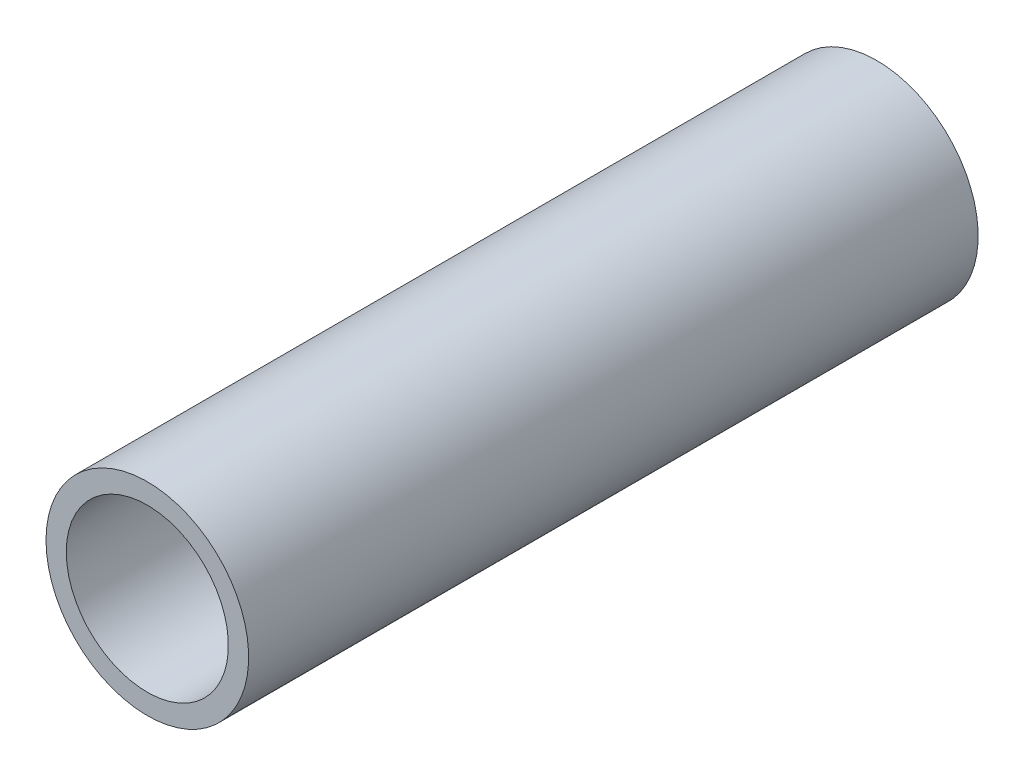
ISO-10303-21;
HEADER;
FILE_DESCRIPTION(('STEP AP214'),'2;1');
FILE_NAME('part.step','',(''),(''),'','','');
FILE_SCHEMA(('AUTOMOTIVE_DESIGN { 1 0 10303 214 1 1 1 1 }'));
ENDSEC;
DATA;
#1=APPLICATION_CONTEXT('core data for automotive mechanical design processes');
#2=APPLICATION_PROTOCOL_DEFINITION('international standard','automotive_design',2000,#1);
#3=PRODUCT_CONTEXT('',#1,'mechanical');
#4=PRODUCT('Part','Part','',(#3));
#5=PRODUCT_RELATED_PRODUCT_CATEGORY('part','',(#4));
#6=PRODUCT_DEFINITION_FORMATION('','',#4);
#7=PRODUCT_DEFINITION_CONTEXT('part definition',#1,'design');
#8=PRODUCT_DEFINITION('design','',#6,#7);
#9=PRODUCT_DEFINITION_SHAPE('','',#8);
#10=(LENGTH_UNIT() NAMED_UNIT(*) SI_UNIT(.MILLI.,.METRE.));
#11=(NAMED_UNIT(*) PLANE_ANGLE_UNIT() SI_UNIT($,.RADIAN.));
#12=(NAMED_UNIT(*) SI_UNIT($,.STERADIAN.) SOLID_ANGLE_UNIT());
#13=UNCERTAINTY_MEASURE_WITH_UNIT(LENGTH_MEASURE(1.E-05),#10,'distance_accuracy_value','');
#14=(GEOMETRIC_REPRESENTATION_CONTEXT(3) GLOBAL_UNCERTAINTY_ASSIGNED_CONTEXT((#13)) GLOBAL_UNIT_ASSIGNED_CONTEXT((#10,
#11,#12)) REPRESENTATION_CONTEXT('',''));
#15=CARTESIAN_POINT('',(0.,0.,0.));
#16=DIRECTION('',(0.,0.,1.));
#17=DIRECTION('',(1.,0.,0.));
#18=AXIS2_PLACEMENT_3D('',#15,#16,#17);
#19=CARTESIAN_POINT('',(0.,0.,90.));
#20=DIRECTION('',(0.,0.,1.));
#21=DIRECTION('',(1.,0.,0.));
#22=AXIS2_PLACEMENT_3D('',#19,#20,#21);
#23=PLANE('',#22);
#24=CARTESIAN_POINT('',(0.,0.,90.));
#25=DIRECTION('',(0.,0.,1.));
#26=DIRECTION('',(1.,0.,0.));
#27=AXIS2_PLACEMENT_3D('',#24,#25,#26);
#28=CIRCLE('',#27,12.5);
#29=CARTESIAN_POINT('',(-12.5,0.,90.));
#30=VERTEX_POINT('',#29);
#31=EDGE_CURVE('E10',#30,#30,#28,.T.);
#32=ORIENTED_EDGE('',*,*,#31,.T.);
#33=EDGE_LOOP('',(#32));
#34=FACE_BOUND('',#33,.T.);
#35=CARTESIAN_POINT('',(0.,0.,90.));
#36=DIRECTION('',(0.,0.,1.));
#37=DIRECTION('',(1.,0.,0.));
#38=AXIS2_PLACEMENT_3D('',#35,#36,#37);
#39=CIRCLE('',#38,10.);
#40=CARTESIAN_POINT('',(-10.,0.,90.));
#41=VERTEX_POINT('',#40);
#42=EDGE_CURVE('E52',#41,#41,#39,.T.);
#43=ORIENTED_EDGE('',*,*,#42,.F.);
#44=EDGE_LOOP('',(#43));
#45=FACE_BOUND('',#44,.T.);
#46=ADVANCED_FACE('F39',(#34,#45),#23,.T.);
#47=CARTESIAN_POINT('',(0.,0.,0.));
#48=DIRECTION('',(0.,0.,1.));
#49=DIRECTION('',(1.,0.,0.));
#50=AXIS2_PLACEMENT_3D('',#47,#48,#49);
#51=PLANE('',#50);
#52=CARTESIAN_POINT('',(0.,0.,0.));
#53=DIRECTION('',(0.,0.,1.));
#54=DIRECTION('',(1.,0.,0.));
#55=AXIS2_PLACEMENT_3D('',#52,#53,#54);
#56=CIRCLE('',#55,12.5);
#57=CARTESIAN_POINT('',(-12.5,0.,0.));
#58=VERTEX_POINT('',#57);
#59=EDGE_CURVE('E43',#58,#58,#56,.T.);
#60=ORIENTED_EDGE('',*,*,#59,.F.);
#61=EDGE_LOOP('',(#60));
#62=FACE_BOUND('',#61,.T.);
#63=CARTESIAN_POINT('',(0.,0.,0.));
#64=DIRECTION('',(0.,0.,1.));
#65=DIRECTION('',(1.,0.,0.));
#66=AXIS2_PLACEMENT_3D('',#63,#64,#65);
#67=CIRCLE('',#66,10.);
#68=CARTESIAN_POINT('',(-10.,0.,0.));
#69=VERTEX_POINT('',#68);
#70=EDGE_CURVE('E54',#69,#69,#67,.T.);
#71=ORIENTED_EDGE('',*,*,#70,.T.);
#72=EDGE_LOOP('',(#71));
#73=FACE_BOUND('',#72,.T.);
#74=ADVANCED_FACE('F66',(#62,#73),#51,.F.);
#75=CARTESIAN_POINT('',(0.,0.,90.));
#76=DIRECTION('',(0.,0.,-1.));
#77=DIRECTION('',(-1.,0.,0.));
#78=AXIS2_PLACEMENT_3D('',#75,#76,#77);
#79=CYLINDRICAL_SURFACE('',#78,12.5);
#80=CARTESIAN_POINT('',(-12.5,0.,90.));
#81=CARTESIAN_POINT('',(-12.5,0.,89.0625));
#82=CARTESIAN_POINT('',(-12.5,0.,88.125));
#83=CARTESIAN_POINT('',(-12.5,0.,86.25));
#84=CARTESIAN_POINT('',(-12.5,0.,85.3125));
#85=CARTESIAN_POINT('',(-12.5,0.,83.4375));
#86=CARTESIAN_POINT('',(-12.5,0.,82.5));
#87=CARTESIAN_POINT('',(-12.5,0.,80.625));
#88=CARTESIAN_POINT('',(-12.5,0.,79.6875));
#89=CARTESIAN_POINT('',(-12.5,0.,77.8125));
#90=CARTESIAN_POINT('',(-12.5,0.,76.875));
#91=CARTESIAN_POINT('',(-12.5,0.,75.));
#92=CARTESIAN_POINT('',(-12.5,0.,74.0625));
#93=CARTESIAN_POINT('',(-12.5,0.,72.1875));
#94=CARTESIAN_POINT('',(-12.5,0.,71.25));
#95=CARTESIAN_POINT('',(-12.5,0.,69.375));
#96=CARTESIAN_POINT('',(-12.5,0.,68.4375));
#97=CARTESIAN_POINT('',(-12.5,0.,66.5625));
#98=CARTESIAN_POINT('',(-12.5,0.,65.625));
#99=CARTESIAN_POINT('',(-12.5,0.,63.75));
#100=CARTESIAN_POINT('',(-12.5,0.,62.8125));
#101=CARTESIAN_POINT('',(-12.5,0.,60.9375));
#102=CARTESIAN_POINT('',(-12.5,0.,60.));
#103=CARTESIAN_POINT('',(-12.5,0.,58.125));
#104=CARTESIAN_POINT('',(-12.5,0.,57.1875));
#105=CARTESIAN_POINT('',(-12.5,0.,55.3125));
#106=CARTESIAN_POINT('',(-12.5,0.,54.375));
#107=CARTESIAN_POINT('',(-12.5,0.,52.5));
#108=CARTESIAN_POINT('',(-12.5,0.,51.5625));
#109=CARTESIAN_POINT('',(-12.5,0.,49.6875));
#110=CARTESIAN_POINT('',(-12.5,0.,48.75));
#111=CARTESIAN_POINT('',(-12.5,0.,46.875));
#112=CARTESIAN_POINT('',(-12.5,0.,45.9375));
#113=CARTESIAN_POINT('',(-12.5,0.,44.0625));
#114=CARTESIAN_POINT('',(-12.5,0.,43.125));
#115=CARTESIAN_POINT('',(-12.5,0.,41.25));
#116=CARTESIAN_POINT('',(-12.5,0.,40.3125));
#117=CARTESIAN_POINT('',(-12.5,0.,38.4375));
#118=CARTESIAN_POINT('',(-12.5,0.,37.5));
#119=CARTESIAN_POINT('',(-12.5,0.,35.625));
#120=CARTESIAN_POINT('',(-12.5,0.,34.6875));
#121=CARTESIAN_POINT('',(-12.5,0.,32.8125));
#122=CARTESIAN_POINT('',(-12.5,0.,31.875));
#123=CARTESIAN_POINT('',(-12.5,0.,30.));
#124=CARTESIAN_POINT('',(-12.5,0.,29.0625));
#125=CARTESIAN_POINT('',(-12.5,0.,27.1875));
#126=CARTESIAN_POINT('',(-12.5,0.,26.25));
#127=CARTESIAN_POINT('',(-12.5,0.,24.375));
#128=CARTESIAN_POINT('',(-12.5,0.,23.4375));
#129=CARTESIAN_POINT('',(-12.5,0.,21.5625));
#130=CARTESIAN_POINT('',(-12.5,0.,20.625));
#131=CARTESIAN_POINT('',(-12.5,0.,18.75));
#132=CARTESIAN_POINT('',(-12.5,0.,17.8125));
#133=CARTESIAN_POINT('',(-12.5,0.,15.9375));
#134=CARTESIAN_POINT('',(-12.5,0.,15.));
#135=CARTESIAN_POINT('',(-12.5,0.,13.125));
#136=CARTESIAN_POINT('',(-12.5,0.,12.1875));
#137=CARTESIAN_POINT('',(-12.5,0.,10.3125));
#138=CARTESIAN_POINT('',(-12.5,0.,9.37499999999999));
#139=CARTESIAN_POINT('',(-12.5,0.,7.49999999999999));
#140=CARTESIAN_POINT('',(-12.5,0.,6.56249999999999));
#141=CARTESIAN_POINT('',(-12.5,0.,4.68749999999999));
#142=CARTESIAN_POINT('',(-12.5,0.,3.74999999999998));
#143=CARTESIAN_POINT('',(-12.5,0.,1.87499999999998));
#144=CARTESIAN_POINT('',(-12.5,0.,0.937499999999986));
#145=CARTESIAN_POINT('',(-12.5,0.,0.));
#146=B_SPLINE_CURVE_WITH_KNOTS('',3,(#80,#81,#82,#83,#84,#85,#86,#87,#88,#89,#90,#91,#92,#93,
#94,#95,#96,#97,#98,#99,#100,#101,#102,#103,#104,#105,#106,#107,#108,#109,#110,#111,#112,#113,
#114,#115,#116,#117,#118,#119,#120,#121,#122,#123,#124,#125,#126,#127,#128,#129,#130,#131,#132,
#133,#134,#135,#136,#137,#138,#139,#140,#141,#142,#143,#144,#145),.UNSPECIFIED.,.F.,.F.,(4,2,2,
2,2,2,2,2,2,2,2,2,2,2,2,2,2,2,2,2,2,2,2,2,2,2,2,2,2,2,2,2,4),(0.,2.81250000000001,
5.62500000000001,8.43750000000001,11.25,14.0625,16.875,19.6875,22.5,25.3125,28.125,30.9375,
33.75,36.5625,39.375,42.1875,45.,47.8125,50.625,53.4375,56.25,59.0625,61.875,64.6875,67.5,
70.3125,73.125,75.9375,78.75,81.5625,84.375,87.1875,90.),.UNSPECIFIED.);
#147=EDGE_CURVE('BSEAM41',#30,#58,#146,.T.);
#148=ORIENTED_EDGE('',*,*,#31,.F.);
#149=ORIENTED_EDGE('',*,*,#59,.T.);
#150=ORIENTED_EDGE('',*,*,#147,.T.);
#151=ORIENTED_EDGE('',*,*,#147,.F.);
#152=EDGE_LOOP('',(#148,#150,#149,#151));
#153=FACE_BOUND('',#152,.T.);
#154=ADVANCED_FACE('F41',(#153),#79,.T.);
#155=CARTESIAN_POINT('',(0.,0.,90.));
#156=DIRECTION('',(0.,0.,-1.));
#157=DIRECTION('',(-1.,0.,0.));
#158=AXIS2_PLACEMENT_3D('',#155,#156,#157);
#159=CYLINDRICAL_SURFACE('',#158,10.);
#160=CARTESIAN_POINT('',(-10.,0.,90.));
#161=CARTESIAN_POINT('',(-10.,0.,89.0625));
#162=CARTESIAN_POINT('',(-10.,0.,88.125));
#163=CARTESIAN_POINT('',(-10.,0.,86.25));
#164=CARTESIAN_POINT('',(-10.,0.,85.3125));
#165=CARTESIAN_POINT('',(-10.,0.,83.4375));
#166=CARTESIAN_POINT('',(-10.,0.,82.5));
#167=CARTESIAN_POINT('',(-10.,0.,80.625));
#168=CARTESIAN_POINT('',(-10.,0.,79.6875));
#169=CARTESIAN_POINT('',(-10.,0.,77.8125));
#170=CARTESIAN_POINT('',(-10.,0.,76.875));
#171=CARTESIAN_POINT('',(-10.,0.,75.));
#172=CARTESIAN_POINT('',(-10.,0.,74.0625));
#173=CARTESIAN_POINT('',(-10.,0.,72.1875));
#174=CARTESIAN_POINT('',(-10.,0.,71.25));
#175=CARTESIAN_POINT('',(-10.,0.,69.375));
#176=CARTESIAN_POINT('',(-10.,0.,68.4375));
#177=CARTESIAN_POINT('',(-10.,0.,66.5625));
#178=CARTESIAN_POINT('',(-10.,0.,65.625));
#179=CARTESIAN_POINT('',(-10.,0.,63.75));
#180=CARTESIAN_POINT('',(-10.,0.,62.8125));
#181=CARTESIAN_POINT('',(-10.,0.,60.9375));
#182=CARTESIAN_POINT('',(-10.,0.,60.));
#183=CARTESIAN_POINT('',(-10.,0.,58.125));
#184=CARTESIAN_POINT('',(-10.,0.,57.1875));
#185=CARTESIAN_POINT('',(-10.,0.,55.3125));
#186=CARTESIAN_POINT('',(-10.,0.,54.375));
#187=CARTESIAN_POINT('',(-10.,0.,52.5));
#188=CARTESIAN_POINT('',(-10.,0.,51.5625));
#189=CARTESIAN_POINT('',(-10.,0.,49.6875));
#190=CARTESIAN_POINT('',(-10.,0.,48.75));
#191=CARTESIAN_POINT('',(-10.,0.,46.875));
#192=CARTESIAN_POINT('',(-10.,0.,45.9375));
#193=CARTESIAN_POINT('',(-10.,0.,44.0625));
#194=CARTESIAN_POINT('',(-10.,0.,43.125));
#195=CARTESIAN_POINT('',(-10.,0.,41.25));
#196=CARTESIAN_POINT('',(-10.,0.,40.3125));
#197=CARTESIAN_POINT('',(-10.,0.,38.4375));
#198=CARTESIAN_POINT('',(-10.,0.,37.5));
#199=CARTESIAN_POINT('',(-10.,0.,35.625));
#200=CARTESIAN_POINT('',(-10.,0.,34.6875));
#201=CARTESIAN_POINT('',(-10.,0.,32.8125));
#202=CARTESIAN_POINT('',(-10.,0.,31.875));
#203=CARTESIAN_POINT('',(-10.,0.,30.));
#204=CARTESIAN_POINT('',(-10.,0.,29.0625));
#205=CARTESIAN_POINT('',(-10.,0.,27.1875));
#206=CARTESIAN_POINT('',(-10.,0.,26.25));
#207=CARTESIAN_POINT('',(-10.,0.,24.375));
#208=CARTESIAN_POINT('',(-10.,0.,23.4375));
#209=CARTESIAN_POINT('',(-10.,0.,21.5625));
#210=CARTESIAN_POINT('',(-10.,0.,20.625));
#211=CARTESIAN_POINT('',(-10.,0.,18.75));
#212=CARTESIAN_POINT('',(-10.,0.,17.8125));
#213=CARTESIAN_POINT('',(-10.,0.,15.9375));
#214=CARTESIAN_POINT('',(-10.,0.,15.));
#215=CARTESIAN_POINT('',(-10.,0.,13.125));
#216=CARTESIAN_POINT('',(-10.,0.,12.1875));
#217=CARTESIAN_POINT('',(-10.,0.,10.3125));
#218=CARTESIAN_POINT('',(-10.,0.,9.37499999999999));
#219=CARTESIAN_POINT('',(-10.,0.,7.49999999999999));
#220=CARTESIAN_POINT('',(-10.,0.,6.56249999999999));
#221=CARTESIAN_POINT('',(-10.,0.,4.68749999999999));
#222=CARTESIAN_POINT('',(-10.,0.,3.74999999999998));
#223=CARTESIAN_POINT('',(-10.,0.,1.87499999999998));
#224=CARTESIAN_POINT('',(-10.,0.,0.937499999999986));
#225=CARTESIAN_POINT('',(-10.,0.,0.));
#226=B_SPLINE_CURVE_WITH_KNOTS('',3,(#160,#161,#162,#163,#164,#165,#166,#167,#168,#169,#170,
#171,#172,#173,#174,#175,#176,#177,#178,#179,#180,#181,#182,#183,#184,#185,#186,#187,#188,#189,
#190,#191,#192,#193,#194,#195,#196,#197,#198,#199,#200,#201,#202,#203,#204,#205,#206,#207,#208,
#209,#210,#211,#212,#213,#214,#215,#216,#217,#218,#219,#220,#221,#222,#223,#224,#225),
.UNSPECIFIED.,.F.,.F.,(4,2,2,2,2,2,2,2,2,2,2,2,2,2,2,2,2,2,2,2,2,2,2,2,2,2,2,2,2,2,2,2,4),(0.,
2.81250000000001,5.62500000000001,8.43750000000001,11.25,14.0625,16.875,19.6875,22.5,25.3125,
28.125,30.9375,33.75,36.5625,39.375,42.1875,45.,47.8125,50.625,53.4375,56.25,59.0625,61.875,
64.6875,67.5,70.3125,73.125,75.9375,78.75,81.5625,84.375,87.1875,90.),.UNSPECIFIED.);
#227=EDGE_CURVE('BSEAM62',#41,#69,#226,.T.);
#228=ORIENTED_EDGE('',*,*,#42,.T.);
#229=ORIENTED_EDGE('',*,*,#70,.F.);
#230=ORIENTED_EDGE('',*,*,#227,.T.);
#231=ORIENTED_EDGE('',*,*,#227,.F.);
#232=EDGE_LOOP('',(#228,#230,#229,#231));
#233=FACE_BOUND('',#232,.T.);
#234=ADVANCED_FACE('F62',(#233),#159,.F.);
#235=CLOSED_SHELL('',(#46,#74,#154,#234));
#236=MANIFOLD_SOLID_BREP('B2',#235);
#237=ADVANCED_BREP_SHAPE_REPRESENTATION('',(#18,#236),#14);
#238=SHAPE_DEFINITION_REPRESENTATION(#9,#237);
ENDSEC;
END-ISO-10303-21;
